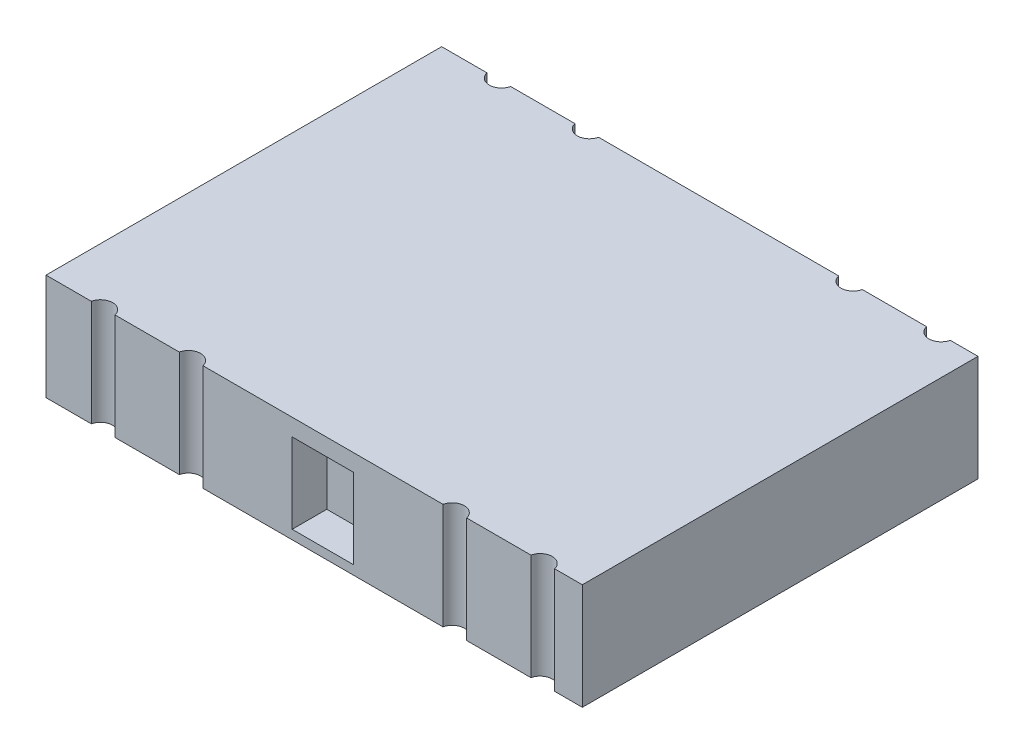
ISO-10303-21;
HEADER;
FILE_DESCRIPTION(('STEP AP214'),'2;1');
FILE_NAME('part.step','',(''),(''),'','','');
FILE_SCHEMA(('AUTOMOTIVE_DESIGN { 1 0 10303 214 1 1 1 1 }'));
ENDSEC;
DATA;
#1=APPLICATION_CONTEXT('core data for automotive mechanical design processes');
#2=APPLICATION_PROTOCOL_DEFINITION('international standard','automotive_design',2000,#1);
#3=PRODUCT_CONTEXT('',#1,'mechanical');
#4=PRODUCT('Part','Part','',(#3));
#5=PRODUCT_RELATED_PRODUCT_CATEGORY('part','',(#4));
#6=PRODUCT_DEFINITION_FORMATION('','',#4);
#7=PRODUCT_DEFINITION_CONTEXT('part definition',#1,'design');
#8=PRODUCT_DEFINITION('design','',#6,#7);
#9=PRODUCT_DEFINITION_SHAPE('','',#8);
#10=(LENGTH_UNIT() NAMED_UNIT(*) SI_UNIT(.MILLI.,.METRE.));
#11=(NAMED_UNIT(*) PLANE_ANGLE_UNIT() SI_UNIT($,.RADIAN.));
#12=(NAMED_UNIT(*) SI_UNIT($,.STERADIAN.) SOLID_ANGLE_UNIT());
#13=UNCERTAINTY_MEASURE_WITH_UNIT(LENGTH_MEASURE(1.E-05),#10,'distance_accuracy_value','');
#14=(GEOMETRIC_REPRESENTATION_CONTEXT(3) GLOBAL_UNCERTAINTY_ASSIGNED_CONTEXT((#13)) GLOBAL_UNIT_ASSIGNED_CONTEXT((#10,
#11,#12)) REPRESENTATION_CONTEXT('',''));
#15=CARTESIAN_POINT('',(0.,0.,0.));
#16=DIRECTION('',(0.,0.,1.));
#17=DIRECTION('',(1.,0.,0.));
#18=AXIS2_PLACEMENT_3D('',#15,#16,#17);
#19=CARTESIAN_POINT('',(1.143,17.1077301496695,5.715));
#20=DIRECTION('',(-1.,0.,0.));
#21=DIRECTION('',(0.,1.,0.));
#22=AXIS2_PLACEMENT_3D('',#19,#20,#21);
#23=PLANE('',#22);
#24=DIRECTION('',(0.,0.,-1.));
#25=VECTOR('',#24,1.);
#26=CARTESIAN_POINT('',(1.143,2.4384,5.715));
#27=LINE('',#26,#25);
#28=CARTESIAN_POINT('',(1.143,2.4384,5.715));
#29=VERTEX_POINT('',#28);
#30=CARTESIAN_POINT('',(1.143,2.4384,4.715));
#31=VERTEX_POINT('',#30);
#32=EDGE_CURVE('E11',#29,#31,#27,.T.);
#33=ORIENTED_EDGE('',*,*,#32,.T.);
#34=DIRECTION('',(0.,-1.,0.));
#35=VECTOR('',#34,1.);
#36=CARTESIAN_POINT('',(1.143,17.1077301496695,4.715));
#37=LINE('',#36,#35);
#38=CARTESIAN_POINT('',(1.143,0.127,4.715));
#39=VERTEX_POINT('',#38);
#40=EDGE_CURVE('E24',#31,#39,#37,.T.);
#41=ORIENTED_EDGE('',*,*,#40,.T.);
#42=DIRECTION('',(0.,0.,-1.));
#43=VECTOR('',#42,1.);
#44=CARTESIAN_POINT('',(1.143,0.127,5.715));
#45=LINE('',#44,#43);
#46=CARTESIAN_POINT('',(1.143,0.127,5.715));
#47=VERTEX_POINT('',#46);
#48=EDGE_CURVE('E418',#47,#39,#45,.T.);
#49=ORIENTED_EDGE('',*,*,#48,.F.);
#50=DIRECTION('',(0.,-1.,0.));
#51=VECTOR('',#50,1.);
#52=CARTESIAN_POINT('',(1.143,17.1077301496695,5.715));
#53=LINE('',#52,#51);
#54=EDGE_CURVE('E415',#29,#47,#53,.T.);
#55=ORIENTED_EDGE('',*,*,#54,.F.);
#56=EDGE_LOOP('',(#33,#41,#49,#55));
#57=FACE_BOUND('',#56,.T.);
#58=ADVANCED_FACE('F17',(#57),#23,.T.);
#59=CARTESIAN_POINT('',(-0.634999999999979,17.1077301496695,4.510628089302));
#60=DIRECTION('',(1.,0.,0.));
#61=DIRECTION('',(0.,-1.,0.));
#62=AXIS2_PLACEMENT_3D('',#59,#60,#61);
#63=PLANE('',#62);
#64=DIRECTION('',(0.,0.,1.));
#65=VECTOR('',#64,1.);
#66=CARTESIAN_POINT('',(-0.634999999999979,0.127,4.510628089302));
#67=LINE('',#66,#65);
#68=CARTESIAN_POINT('',(-0.634999999999979,0.127,4.715));
#69=VERTEX_POINT('',#68);
#70=CARTESIAN_POINT('',(-0.634999999999979,0.127,5.715));
#71=VERTEX_POINT('',#70);
#72=EDGE_CURVE('E413',#69,#71,#67,.T.);
#73=ORIENTED_EDGE('',*,*,#72,.F.);
#74=DIRECTION('',(0.,1.,0.));
#75=VECTOR('',#74,1.);
#76=CARTESIAN_POINT('',(-0.634999999999979,17.1077301496695,4.715));
#77=LINE('',#76,#75);
#78=CARTESIAN_POINT('',(-0.634999999999979,2.4384,4.715));
#79=VERTEX_POINT('',#78);
#80=EDGE_CURVE('E411',#69,#79,#77,.T.);
#81=ORIENTED_EDGE('',*,*,#80,.T.);
#82=DIRECTION('',(0.,0.,1.));
#83=VECTOR('',#82,1.);
#84=CARTESIAN_POINT('',(-0.634999999999979,2.4384,4.510628089302));
#85=LINE('',#84,#83);
#86=CARTESIAN_POINT('',(-0.634999999999979,2.4384,5.715));
#87=VERTEX_POINT('',#86);
#88=EDGE_CURVE('E409',#79,#87,#85,.T.);
#89=ORIENTED_EDGE('',*,*,#88,.T.);
#90=DIRECTION('',(0.,-1.,0.));
#91=VECTOR('',#90,1.);
#92=CARTESIAN_POINT('',(-0.634999999999979,17.1077301496695,5.715));
#93=LINE('',#92,#91);
#94=EDGE_CURVE('E406',#87,#71,#93,.T.);
#95=ORIENTED_EDGE('',*,*,#94,.T.);
#96=EDGE_LOOP('',(#73,#81,#89,#95));
#97=FACE_BOUND('',#96,.T.);
#98=ADVANCED_FACE('F429',(#97),#63,.T.);
#99=CARTESIAN_POINT('',(-0.634999999999979,17.1077301496695,-5.715));
#100=DIRECTION('',(1.,0.,0.));
#101=DIRECTION('',(0.,-1.,0.));
#102=AXIS2_PLACEMENT_3D('',#99,#100,#101);
#103=PLANE('',#102);
#104=DIRECTION('',(0.,0.,1.));
#105=VECTOR('',#104,1.);
#106=CARTESIAN_POINT('',(-0.634999999999979,2.4384,-5.715));
#107=LINE('',#106,#105);
#108=CARTESIAN_POINT('',(-0.634999999999979,2.4384,-5.7149999999999));
#109=VERTEX_POINT('',#108);
#110=CARTESIAN_POINT('',(-0.634999999999979,2.4384,-4.7149999999999));
#111=VERTEX_POINT('',#110);
#112=EDGE_CURVE('E404',#109,#111,#107,.T.);
#113=ORIENTED_EDGE('',*,*,#112,.T.);
#114=DIRECTION('',(0.,-1.,0.));
#115=VECTOR('',#114,1.);
#116=CARTESIAN_POINT('',(-0.634999999999979,17.1077301496695,-4.7149999999999));
#117=LINE('',#116,#115);
#118=CARTESIAN_POINT('',(-0.634999999999979,0.127,-4.7149999999999));
#119=VERTEX_POINT('',#118);
#120=EDGE_CURVE('E402',#111,#119,#117,.T.);
#121=ORIENTED_EDGE('',*,*,#120,.T.);
#122=DIRECTION('',(0.,0.,1.));
#123=VECTOR('',#122,1.);
#124=CARTESIAN_POINT('',(-0.634999999999979,0.127,-5.715));
#125=LINE('',#124,#123);
#126=CARTESIAN_POINT('',(-0.634999999999979,0.127,-5.715));
#127=VERTEX_POINT('',#126);
#128=EDGE_CURVE('E399',#127,#119,#125,.T.);
#129=ORIENTED_EDGE('',*,*,#128,.F.);
#130=DIRECTION('',(0.,-1.,0.));
#131=VECTOR('',#130,1.);
#132=CARTESIAN_POINT('',(-0.634999999999979,17.1077301496695,-5.715));
#133=LINE('',#132,#131);
#134=EDGE_CURVE('E396',#109,#127,#133,.T.);
#135=ORIENTED_EDGE('',*,*,#134,.F.);
#136=EDGE_LOOP('',(#113,#121,#129,#135));
#137=FACE_BOUND('',#136,.T.);
#138=ADVANCED_FACE('F453',(#137),#103,.T.);
#139=CARTESIAN_POINT('',(1.143,17.1077301496695,-4.510628089302));
#140=DIRECTION('',(-1.,0.,0.));
#141=DIRECTION('',(0.,1.,0.));
#142=AXIS2_PLACEMENT_3D('',#139,#140,#141);
#143=PLANE('',#142);
#144=DIRECTION('',(0.,0.,-1.));
#145=VECTOR('',#144,1.);
#146=CARTESIAN_POINT('',(1.143,0.127,-4.510628089302));
#147=LINE('',#146,#145);
#148=CARTESIAN_POINT('',(1.143,0.127,-4.7149999999999));
#149=VERTEX_POINT('',#148);
#150=CARTESIAN_POINT('',(1.143,0.127,-5.715));
#151=VERTEX_POINT('',#150);
#152=EDGE_CURVE('E394',#149,#151,#147,.T.);
#153=ORIENTED_EDGE('',*,*,#152,.F.);
#154=DIRECTION('',(0.,1.,0.));
#155=VECTOR('',#154,1.);
#156=CARTESIAN_POINT('',(1.143,17.1077301496695,-4.7149999999999));
#157=LINE('',#156,#155);
#158=CARTESIAN_POINT('',(1.143,2.4384,-4.7149999999999));
#159=VERTEX_POINT('',#158);
#160=EDGE_CURVE('E392',#149,#159,#157,.T.);
#161=ORIENTED_EDGE('',*,*,#160,.T.);
#162=DIRECTION('',(0.,0.,-1.));
#163=VECTOR('',#162,1.);
#164=CARTESIAN_POINT('',(1.143,2.4384,-4.510628089302));
#165=LINE('',#164,#163);
#166=CARTESIAN_POINT('',(1.143,2.4384,-5.715));
#167=VERTEX_POINT('',#166);
#168=EDGE_CURVE('E390',#159,#167,#165,.T.);
#169=ORIENTED_EDGE('',*,*,#168,.T.);
#170=DIRECTION('',(0.,-1.,0.));
#171=VECTOR('',#170,1.);
#172=CARTESIAN_POINT('',(1.143,17.1077301496695,-5.715));
#173=LINE('',#172,#171);
#174=EDGE_CURVE('E387',#167,#151,#173,.T.);
#175=ORIENTED_EDGE('',*,*,#174,.T.);
#176=EDGE_LOOP('',(#153,#161,#169,#175));
#177=FACE_BOUND('',#176,.T.);
#178=ADVANCED_FACE('F457',(#177),#143,.T.);
#179=CARTESIAN_POINT('',(0.254000000000129,0.127,0.));
#180=DIRECTION('',(0.,1.,0.));
#181=DIRECTION('',(1.,0.,0.));
#182=AXIS2_PLACEMENT_3D('',#179,#180,#181);
#183=PLANE('',#182);
#184=ORIENTED_EDGE('',*,*,#48,.T.);
#185=DIRECTION('',(1.,0.,0.));
#186=VECTOR('',#185,1.);
#187=CARTESIAN_POINT('',(-6.9400186103651,0.127,4.715));
#188=LINE('',#187,#186);
#189=EDGE_CURVE('E384',#69,#39,#188,.T.);
#190=ORIENTED_EDGE('',*,*,#189,.F.);
#191=ORIENTED_EDGE('',*,*,#72,.T.);
#192=DIRECTION('',(1.,0.,0.));
#193=VECTOR('',#192,1.);
#194=CARTESIAN_POINT('',(-0.634999999999979,0.127,5.715));
#195=LINE('',#194,#193);
#196=EDGE_CURVE('E381',#71,#47,#195,.T.);
#197=ORIENTED_EDGE('',*,*,#196,.T.);
#198=EDGE_LOOP('',(#184,#190,#191,#197));
#199=FACE_BOUND('',#198,.T.);
#200=ADVANCED_FACE('F423',(#199),#183,.T.);
#201=CARTESIAN_POINT('',(0.254000000000129,0.127,0.));
#202=DIRECTION('',(0.,1.,0.));
#203=DIRECTION('',(1.,0.,0.));
#204=AXIS2_PLACEMENT_3D('',#201,#202,#203);
#205=PLANE('',#204);
#206=ORIENTED_EDGE('',*,*,#128,.T.);
#207=DIRECTION('',(-1.,0.,0.));
#208=VECTOR('',#207,1.);
#209=CARTESIAN_POINT('',(-6.9400186103651,0.127,-4.7149999999999));
#210=LINE('',#209,#208);
#211=EDGE_CURVE('E378',#149,#119,#210,.T.);
#212=ORIENTED_EDGE('',*,*,#211,.F.);
#213=ORIENTED_EDGE('',*,*,#152,.T.);
#214=DIRECTION('',(-1.,0.,0.));
#215=VECTOR('',#214,1.);
#216=CARTESIAN_POINT('',(1.143,0.127,-5.715));
#217=LINE('',#216,#215);
#218=EDGE_CURVE('E375',#151,#127,#217,.T.);
#219=ORIENTED_EDGE('',*,*,#218,.T.);
#220=EDGE_LOOP('',(#206,#212,#213,#219));
#221=FACE_BOUND('',#220,.T.);
#222=ADVANCED_FACE('F466',(#221),#205,.T.);
#223=CARTESIAN_POINT('',(0.,2.4384,0.));
#224=DIRECTION('',(0.,1.,0.));
#225=DIRECTION('',(1.,0.,0.));
#226=AXIS2_PLACEMENT_3D('',#223,#224,#225);
#227=PLANE('',#226);
#228=DIRECTION('',(-1.,0.,0.));
#229=VECTOR('',#228,1.);
#230=CARTESIAN_POINT('',(0.,2.4384,4.715));
#231=LINE('',#230,#229);
#232=EDGE_CURVE('E372',#31,#79,#231,.T.);
#233=ORIENTED_EDGE('',*,*,#232,.F.);
#234=ORIENTED_EDGE('',*,*,#32,.F.);
#235=DIRECTION('',(1.,0.,0.));
#236=VECTOR('',#235,1.);
#237=CARTESIAN_POINT('',(-0.634999999999979,2.4384,5.715));
#238=LINE('',#237,#236);
#239=EDGE_CURVE('E369',#87,#29,#238,.T.);
#240=ORIENTED_EDGE('',*,*,#239,.F.);
#241=ORIENTED_EDGE('',*,*,#88,.F.);
#242=EDGE_LOOP('',(#233,#234,#240,#241));
#243=FACE_BOUND('',#242,.T.);
#244=ADVANCED_FACE('F431',(#243),#227,.F.);
#245=CARTESIAN_POINT('',(0.,2.4384,0.));
#246=DIRECTION('',(0.,1.,0.));
#247=DIRECTION('',(1.,0.,0.));
#248=AXIS2_PLACEMENT_3D('',#245,#246,#247);
#249=PLANE('',#248);
#250=DIRECTION('',(1.,0.,0.));
#251=VECTOR('',#250,1.);
#252=CARTESIAN_POINT('',(0.,2.4384,-4.7149999999999));
#253=LINE('',#252,#251);
#254=EDGE_CURVE('E366',#111,#159,#253,.T.);
#255=ORIENTED_EDGE('',*,*,#254,.F.);
#256=ORIENTED_EDGE('',*,*,#112,.F.);
#257=DIRECTION('',(-1.,0.,0.));
#258=VECTOR('',#257,1.);
#259=CARTESIAN_POINT('',(1.143,2.4384,-5.715));
#260=LINE('',#259,#258);
#261=EDGE_CURVE('E363',#167,#109,#260,.T.);
#262=ORIENTED_EDGE('',*,*,#261,.F.);
#263=ORIENTED_EDGE('',*,*,#168,.F.);
#264=EDGE_LOOP('',(#255,#256,#262,#263));
#265=FACE_BOUND('',#264,.T.);
#266=ADVANCED_FACE('F436',(#265),#249,.F.);
#267=CARTESIAN_POINT('',(3.7223956089275,2.794,5.715));
#268=DIRECTION('',(0.,0.,-1.));
#269=DIRECTION('',(0.,1.,0.));
#270=AXIS2_PLACEMENT_3D('',#267,#268,#269);
#271=PLANE('',#270);
#272=DIRECTION('',(0.,-1.,0.));
#273=VECTOR('',#272,1.);
#274=CARTESIAN_POINT('',(-3.2143956089275,2.794,5.715));
#275=LINE('',#274,#273);
#276=CARTESIAN_POINT('',(-3.2143956089275,2.9306,5.715));
#277=VERTEX_POINT('',#276);
#278=CARTESIAN_POINT('',(-3.2143956089275,-0.1366,5.715));
#279=VERTEX_POINT('',#278);
#280=EDGE_CURVE('E361',#277,#279,#275,.T.);
#281=ORIENTED_EDGE('',*,*,#280,.T.);
#282=DIRECTION('',(1.,0.,0.));
#283=VECTOR('',#282,1.);
#284=CARTESIAN_POINT('',(3.7223956089275,-0.1366,5.715));
#285=LINE('',#284,#283);
#286=CARTESIAN_POINT('',(3.7223956089275,-0.1366,5.715));
#287=VERTEX_POINT('',#286);
#288=EDGE_CURVE('E359',#279,#287,#285,.T.);
#289=ORIENTED_EDGE('',*,*,#288,.T.);
#290=DIRECTION('',(0.,-1.,0.));
#291=VECTOR('',#290,1.);
#292=CARTESIAN_POINT('',(3.7223956089275,2.794,5.715));
#293=LINE('',#292,#291);
#294=CARTESIAN_POINT('',(3.7223956089275,2.9306,5.715));
#295=VERTEX_POINT('',#294);
#296=EDGE_CURVE('E356',#295,#287,#293,.T.);
#297=ORIENTED_EDGE('',*,*,#296,.F.);
#298=DIRECTION('',(1.,0.,0.));
#299=VECTOR('',#298,1.);
#300=CARTESIAN_POINT('',(3.7223956089275,2.9306,5.715));
#301=LINE('',#300,#299);
#302=EDGE_CURVE('E353',#277,#295,#301,.T.);
#303=ORIENTED_EDGE('',*,*,#302,.F.);
#304=EDGE_LOOP('',(#281,#289,#297,#303));
#305=FACE_BOUND('',#304,.T.);
#306=ORIENTED_EDGE('',*,*,#196,.F.);
#307=ORIENTED_EDGE('',*,*,#94,.F.);
#308=ORIENTED_EDGE('',*,*,#239,.T.);
#309=ORIENTED_EDGE('',*,*,#54,.T.);
#310=EDGE_LOOP('',(#306,#307,#308,#309));
#311=FACE_BOUND('',#310,.T.);
#312=ADVANCED_FACE('F433',(#305,#311),#271,.F.);
#313=CARTESIAN_POINT('',(-3.2143956089275,2.794,-5.7149999999999));
#314=DIRECTION('',(0.,0.,1.));
#315=DIRECTION('',(0.,-1.,0.));
#316=AXIS2_PLACEMENT_3D('',#313,#314,#315);
#317=PLANE('',#316);
#318=DIRECTION('',(0.,-1.,0.));
#319=VECTOR('',#318,1.);
#320=CARTESIAN_POINT('',(3.7223956089275,2.794,-5.7149999999999));
#321=LINE('',#320,#319);
#322=CARTESIAN_POINT('',(3.7223956089275,2.9306,-5.7149999999999));
#323=VERTEX_POINT('',#322);
#324=CARTESIAN_POINT('',(3.7223956089275,-0.1366,-5.7149999999999));
#325=VERTEX_POINT('',#324);
#326=EDGE_CURVE('E351',#323,#325,#321,.T.);
#327=ORIENTED_EDGE('',*,*,#326,.T.);
#328=DIRECTION('',(-1.,0.,0.));
#329=VECTOR('',#328,1.);
#330=CARTESIAN_POINT('',(-3.2143956089275,-0.1366,-5.7149999999999));
#331=LINE('',#330,#329);
#332=CARTESIAN_POINT('',(-3.2143956089275,-0.1366,-5.7149999999999));
#333=VERTEX_POINT('',#332);
#334=EDGE_CURVE('E349',#325,#333,#331,.T.);
#335=ORIENTED_EDGE('',*,*,#334,.T.);
#336=DIRECTION('',(0.,-1.,0.));
#337=VECTOR('',#336,1.);
#338=CARTESIAN_POINT('',(-3.2143956089275,2.794,-5.7149999999999));
#339=LINE('',#338,#337);
#340=CARTESIAN_POINT('',(-3.2143956089275,2.9306,-5.7149999999999));
#341=VERTEX_POINT('',#340);
#342=EDGE_CURVE('E346',#341,#333,#339,.T.);
#343=ORIENTED_EDGE('',*,*,#342,.F.);
#344=DIRECTION('',(-1.,0.,0.));
#345=VECTOR('',#344,1.);
#346=CARTESIAN_POINT('',(-3.2143956089275,2.9306,-5.7149999999999));
#347=LINE('',#346,#345);
#348=EDGE_CURVE('E343',#323,#341,#347,.T.);
#349=ORIENTED_EDGE('',*,*,#348,.F.);
#350=EDGE_LOOP('',(#327,#335,#343,#349));
#351=FACE_BOUND('',#350,.T.);
#352=ORIENTED_EDGE('',*,*,#218,.F.);
#353=ORIENTED_EDGE('',*,*,#174,.F.);
#354=ORIENTED_EDGE('',*,*,#261,.T.);
#355=ORIENTED_EDGE('',*,*,#134,.T.);
#356=EDGE_LOOP('',(#352,#353,#354,#355));
#357=FACE_BOUND('',#356,.T.);
#358=ADVANCED_FACE('F435',(#351,#357),#317,.F.);
#359=CARTESIAN_POINT('',(-6.096,2.794,5.7912));
#360=DIRECTION('',(0.,-1.,0.));
#361=DIRECTION('',(-1.,0.,0.));
#362=AXIS2_PLACEMENT_3D('',#359,#360,#361);
#363=CYLINDRICAL_SURFACE('',#362,0.35);
#364=DIRECTION('',(0.,-1.,0.));
#365=VECTOR('',#364,1.);
#366=CARTESIAN_POINT('',(-6.4376043910725,2.794,5.715));
#367=LINE('',#366,#365);
#368=CARTESIAN_POINT('',(-6.4376043910725,2.9306,5.715));
#369=VERTEX_POINT('',#368);
#370=CARTESIAN_POINT('',(-6.4376043910725,-0.1366,5.715));
#371=VERTEX_POINT('',#370);
#372=EDGE_CURVE('E222',#369,#371,#367,.T.);
#373=ORIENTED_EDGE('',*,*,#372,.T.);
#374=CARTESIAN_POINT('',(-6.096,-0.1366,5.7912));
#375=DIRECTION('',(0.,-1.,0.));
#376=DIRECTION('',(1.,0.,0.));
#377=AXIS2_PLACEMENT_3D('',#374,#375,#376);
#378=CIRCLE('',#377,0.35);
#379=CARTESIAN_POINT('',(-5.7543956089275,-0.1366,5.715));
#380=VERTEX_POINT('',#379);
#381=EDGE_CURVE('E339',#371,#380,#378,.T.);
#382=ORIENTED_EDGE('',*,*,#381,.T.);
#383=DIRECTION('',(0.,-1.,0.));
#384=VECTOR('',#383,1.);
#385=CARTESIAN_POINT('',(-5.7543956089275,2.794,5.715));
#386=LINE('',#385,#384);
#387=CARTESIAN_POINT('',(-5.7543956089275,2.9306,5.715));
#388=VERTEX_POINT('',#387);
#389=EDGE_CURVE('E337',#388,#380,#386,.T.);
#390=ORIENTED_EDGE('',*,*,#389,.F.);
#391=CARTESIAN_POINT('',(-6.096,2.9306,5.7912));
#392=DIRECTION('',(0.,-1.,0.));
#393=DIRECTION('',(1.,0.,0.));
#394=AXIS2_PLACEMENT_3D('',#391,#392,#393);
#395=CIRCLE('',#394,0.35);
#396=EDGE_CURVE('E335',#369,#388,#395,.T.);
#397=ORIENTED_EDGE('',*,*,#396,.F.);
#398=EDGE_LOOP('',(#373,#382,#390,#397));
#399=FACE_BOUND('',#398,.T.);
#400=ADVANCED_FACE('F444',(#399),#363,.F.);
#401=CARTESIAN_POINT('',(-3.8976043910725,2.794,5.715));
#402=DIRECTION('',(0.,0.,-1.));
#403=DIRECTION('',(0.,1.,0.));
#404=AXIS2_PLACEMENT_3D('',#401,#402,#403);
#405=PLANE('',#404);
#406=ORIENTED_EDGE('',*,*,#389,.T.);
#407=DIRECTION('',(1.,0.,0.));
#408=VECTOR('',#407,1.);
#409=CARTESIAN_POINT('',(-3.8976043910725,-0.1366,5.715));
#410=LINE('',#409,#408);
#411=CARTESIAN_POINT('',(-3.8976043910725,-0.1366,5.715));
#412=VERTEX_POINT('',#411);
#413=EDGE_CURVE('E333',#380,#412,#410,.T.);
#414=ORIENTED_EDGE('',*,*,#413,.T.);
#415=DIRECTION('',(0.,-1.,0.));
#416=VECTOR('',#415,1.);
#417=CARTESIAN_POINT('',(-3.8976043910725,2.794,5.715));
#418=LINE('',#417,#416);
#419=CARTESIAN_POINT('',(-3.8976043910725,2.9306,5.715));
#420=VERTEX_POINT('',#419);
#421=EDGE_CURVE('E330',#420,#412,#418,.T.);
#422=ORIENTED_EDGE('',*,*,#421,.F.);
#423=DIRECTION('',(1.,0.,0.));
#424=VECTOR('',#423,1.);
#425=CARTESIAN_POINT('',(-3.8976043910725,2.9306,5.715));
#426=LINE('',#425,#424);
#427=EDGE_CURVE('E327',#388,#420,#426,.T.);
#428=ORIENTED_EDGE('',*,*,#427,.F.);
#429=EDGE_LOOP('',(#406,#414,#422,#428));
#430=FACE_BOUND('',#429,.T.);
#431=ADVANCED_FACE('F506',(#430),#405,.F.);
#432=CARTESIAN_POINT('',(-3.556,2.794,5.7912));
#433=DIRECTION('',(0.,-1.,0.));
#434=DIRECTION('',(-1.,0.,0.));
#435=AXIS2_PLACEMENT_3D('',#432,#433,#434);
#436=CYLINDRICAL_SURFACE('',#435,0.350000000000001);
#437=ORIENTED_EDGE('',*,*,#421,.T.);
#438=CARTESIAN_POINT('',(-3.556,-0.1366,5.7912));
#439=DIRECTION('',(0.,-1.,0.));
#440=DIRECTION('',(1.,0.,0.));
#441=AXIS2_PLACEMENT_3D('',#438,#439,#440);
#442=CIRCLE('',#441,0.350000000000001);
#443=EDGE_CURVE('E324',#412,#279,#442,.T.);
#444=ORIENTED_EDGE('',*,*,#443,.T.);
#445=ORIENTED_EDGE('',*,*,#280,.F.);
#446=CARTESIAN_POINT('',(-3.556,2.9306,5.7912));
#447=DIRECTION('',(0.,-1.,0.));
#448=DIRECTION('',(1.,0.,0.));
#449=AXIS2_PLACEMENT_3D('',#446,#447,#448);
#450=CIRCLE('',#449,0.350000000000001);
#451=EDGE_CURVE('E321',#420,#277,#450,.T.);
#452=ORIENTED_EDGE('',*,*,#451,.F.);
#453=EDGE_LOOP('',(#437,#444,#445,#452));
#454=FACE_BOUND('',#453,.T.);
#455=ADVANCED_FACE('F516',(#454),#436,.F.);
#456=CARTESIAN_POINT('',(4.064,2.794,5.7912));
#457=DIRECTION('',(0.,-1.,0.));
#458=DIRECTION('',(-1.,0.,0.));
#459=AXIS2_PLACEMENT_3D('',#456,#457,#458);
#460=CYLINDRICAL_SURFACE('',#459,0.350000000000001);
#461=ORIENTED_EDGE('',*,*,#296,.T.);
#462=CARTESIAN_POINT('',(4.064,-0.1366,5.7912));
#463=DIRECTION('',(0.,-1.,0.));
#464=DIRECTION('',(1.,0.,0.));
#465=AXIS2_PLACEMENT_3D('',#462,#463,#464);
#466=CIRCLE('',#465,0.350000000000001);
#467=CARTESIAN_POINT('',(4.4056043910725,-0.1366,5.715));
#468=VERTEX_POINT('',#467);
#469=EDGE_CURVE('E318',#287,#468,#466,.T.);
#470=ORIENTED_EDGE('',*,*,#469,.T.);
#471=DIRECTION('',(0.,-1.,0.));
#472=VECTOR('',#471,1.);
#473=CARTESIAN_POINT('',(4.4056043910725,2.794,5.715));
#474=LINE('',#473,#472);
#475=CARTESIAN_POINT('',(4.4056043910725,2.9306,5.715));
#476=VERTEX_POINT('',#475);
#477=EDGE_CURVE('E316',#476,#468,#474,.T.);
#478=ORIENTED_EDGE('',*,*,#477,.F.);
#479=CARTESIAN_POINT('',(4.064,2.9306,5.7912));
#480=DIRECTION('',(0.,-1.,0.));
#481=DIRECTION('',(1.,0.,0.));
#482=AXIS2_PLACEMENT_3D('',#479,#480,#481);
#483=CIRCLE('',#482,0.350000000000001);
#484=EDGE_CURVE('E314',#295,#476,#483,.T.);
#485=ORIENTED_EDGE('',*,*,#484,.F.);
#486=EDGE_LOOP('',(#461,#470,#478,#485));
#487=FACE_BOUND('',#486,.T.);
#488=ADVANCED_FACE('F526',(#487),#460,.F.);
#489=CARTESIAN_POINT('',(6.2623956089275,2.794,5.715));
#490=DIRECTION('',(0.,0.,-1.));
#491=DIRECTION('',(0.,1.,0.));
#492=AXIS2_PLACEMENT_3D('',#489,#490,#491);
#493=PLANE('',#492);
#494=ORIENTED_EDGE('',*,*,#477,.T.);
#495=DIRECTION('',(1.,0.,0.));
#496=VECTOR('',#495,1.);
#497=CARTESIAN_POINT('',(6.2623956089275,-0.1366,5.715));
#498=LINE('',#497,#496);
#499=CARTESIAN_POINT('',(6.2623956089275,-0.1366,5.715));
#500=VERTEX_POINT('',#499);
#501=EDGE_CURVE('E312',#468,#500,#498,.T.);
#502=ORIENTED_EDGE('',*,*,#501,.T.);
#503=DIRECTION('',(0.,-1.,0.));
#504=VECTOR('',#503,1.);
#505=CARTESIAN_POINT('',(6.2623956089275,2.794,5.715));
#506=LINE('',#505,#504);
#507=CARTESIAN_POINT('',(6.2623956089275,2.9306,5.715));
#508=VERTEX_POINT('',#507);
#509=EDGE_CURVE('E309',#508,#500,#506,.T.);
#510=ORIENTED_EDGE('',*,*,#509,.F.);
#511=DIRECTION('',(1.,0.,0.));
#512=VECTOR('',#511,1.);
#513=CARTESIAN_POINT('',(6.2623956089275,2.9306,5.715));
#514=LINE('',#513,#512);
#515=EDGE_CURVE('E306',#476,#508,#514,.T.);
#516=ORIENTED_EDGE('',*,*,#515,.F.);
#517=EDGE_LOOP('',(#494,#502,#510,#516));
#518=FACE_BOUND('',#517,.T.);
#519=ADVANCED_FACE('F536',(#518),#493,.F.);
#520=CARTESIAN_POINT('',(6.604,2.794,5.7912));
#521=DIRECTION('',(0.,-1.,0.));
#522=DIRECTION('',(-1.,0.,0.));
#523=AXIS2_PLACEMENT_3D('',#520,#521,#522);
#524=CYLINDRICAL_SURFACE('',#523,0.350000000000001);
#525=ORIENTED_EDGE('',*,*,#509,.T.);
#526=CARTESIAN_POINT('',(6.604,-0.1366,5.7912));
#527=DIRECTION('',(0.,-1.,0.));
#528=DIRECTION('',(1.,0.,0.));
#529=AXIS2_PLACEMENT_3D('',#526,#527,#528);
#530=CIRCLE('',#529,0.350000000000001);
#531=CARTESIAN_POINT('',(6.9456043910725,-0.1366,5.715));
#532=VERTEX_POINT('',#531);
#533=EDGE_CURVE('E303',#500,#532,#530,.T.);
#534=ORIENTED_EDGE('',*,*,#533,.T.);
#535=DIRECTION('',(0.,-1.,0.));
#536=VECTOR('',#535,1.);
#537=CARTESIAN_POINT('',(6.9456043910725,2.794,5.715));
#538=LINE('',#537,#536);
#539=CARTESIAN_POINT('',(6.9456043910725,2.9306,5.715));
#540=VERTEX_POINT('',#539);
#541=EDGE_CURVE('E301',#540,#532,#538,.T.);
#542=ORIENTED_EDGE('',*,*,#541,.F.);
#543=CARTESIAN_POINT('',(6.604,2.9306,5.7912));
#544=DIRECTION('',(0.,-1.,0.));
#545=DIRECTION('',(1.,0.,0.));
#546=AXIS2_PLACEMENT_3D('',#543,#544,#545);
#547=CIRCLE('',#546,0.350000000000001);
#548=EDGE_CURVE('E299',#508,#540,#547,.T.);
#549=ORIENTED_EDGE('',*,*,#548,.F.);
#550=EDGE_LOOP('',(#525,#534,#542,#549));
#551=FACE_BOUND('',#550,.T.);
#552=ADVANCED_FACE('F546',(#551),#524,.F.);
#553=CARTESIAN_POINT('',(7.747,2.794,5.715));
#554=DIRECTION('',(0.,0.,-1.));
#555=DIRECTION('',(0.,1.,0.));
#556=AXIS2_PLACEMENT_3D('',#553,#554,#555);
#557=PLANE('',#556);
#558=ORIENTED_EDGE('',*,*,#541,.T.);
#559=DIRECTION('',(1.,0.,0.));
#560=VECTOR('',#559,1.);
#561=CARTESIAN_POINT('',(7.747,-0.1366,5.715));
#562=LINE('',#561,#560);
#563=CARTESIAN_POINT('',(7.747,-0.1366,5.715));
#564=VERTEX_POINT('',#563);
#565=EDGE_CURVE('E297',#532,#564,#562,.T.);
#566=ORIENTED_EDGE('',*,*,#565,.T.);
#567=DIRECTION('',(0.,-1.,0.));
#568=VECTOR('',#567,1.);
#569=CARTESIAN_POINT('',(7.747,2.794,5.715));
#570=LINE('',#569,#568);
#571=CARTESIAN_POINT('',(7.747,2.9306,5.715));
#572=VERTEX_POINT('',#571);
#573=EDGE_CURVE('E294',#572,#564,#570,.T.);
#574=ORIENTED_EDGE('',*,*,#573,.F.);
#575=DIRECTION('',(1.,0.,0.));
#576=VECTOR('',#575,1.);
#577=CARTESIAN_POINT('',(7.747,2.9306,5.715));
#578=LINE('',#577,#576);
#579=EDGE_CURVE('E291',#540,#572,#578,.T.);
#580=ORIENTED_EDGE('',*,*,#579,.F.);
#581=EDGE_LOOP('',(#558,#566,#574,#580));
#582=FACE_BOUND('',#581,.T.);
#583=ADVANCED_FACE('F556',(#582),#557,.F.);
#584=CARTESIAN_POINT('',(7.747,2.794,-5.715));
#585=DIRECTION('',(-1.,0.,0.));
#586=DIRECTION('',(0.,1.,0.));
#587=AXIS2_PLACEMENT_3D('',#584,#585,#586);
#588=PLANE('',#587);
#589=ORIENTED_EDGE('',*,*,#573,.T.);
#590=DIRECTION('',(0.,0.,-1.));
#591=VECTOR('',#590,1.);
#592=CARTESIAN_POINT('',(7.747,-0.1366,-5.715));
#593=LINE('',#592,#591);
#594=CARTESIAN_POINT('',(7.747,-0.1366,-5.715));
#595=VERTEX_POINT('',#594);
#596=EDGE_CURVE('E289',#564,#595,#593,.T.);
#597=ORIENTED_EDGE('',*,*,#596,.T.);
#598=DIRECTION('',(0.,-1.,0.));
#599=VECTOR('',#598,1.);
#600=CARTESIAN_POINT('',(7.747,2.794,-5.715));
#601=LINE('',#600,#599);
#602=CARTESIAN_POINT('',(7.747,2.9306,-5.715));
#603=VERTEX_POINT('',#602);
#604=EDGE_CURVE('E286',#603,#595,#601,.T.);
#605=ORIENTED_EDGE('',*,*,#604,.F.);
#606=DIRECTION('',(0.,0.,-1.));
#607=VECTOR('',#606,1.);
#608=CARTESIAN_POINT('',(7.747,2.9306,-5.715));
#609=LINE('',#608,#607);
#610=EDGE_CURVE('E283',#572,#603,#609,.T.);
#611=ORIENTED_EDGE('',*,*,#610,.F.);
#612=EDGE_LOOP('',(#589,#597,#605,#611));
#613=FACE_BOUND('',#612,.T.);
#614=ADVANCED_FACE('F566',(#613),#588,.F.);
#615=CARTESIAN_POINT('',(6.9456043910725,2.794,-5.7149999999999));
#616=DIRECTION('',(0.,0.,1.));
#617=DIRECTION('',(1.,0.,0.));
#618=AXIS2_PLACEMENT_3D('',#615,#616,#617);
#619=PLANE('',#618);
#620=ORIENTED_EDGE('',*,*,#604,.T.);
#621=DIRECTION('',(-1.,0.,0.));
#622=VECTOR('',#621,1.);
#623=CARTESIAN_POINT('',(6.9456043910725,-0.1366,-5.7149999999999));
#624=LINE('',#623,#622);
#625=CARTESIAN_POINT('',(6.9456043910725,-0.1366,-5.7149999999999));
#626=VERTEX_POINT('',#625);
#627=EDGE_CURVE('E281',#595,#626,#624,.T.);
#628=ORIENTED_EDGE('',*,*,#627,.T.);
#629=DIRECTION('',(0.,-1.,0.));
#630=VECTOR('',#629,1.);
#631=CARTESIAN_POINT('',(6.9456043910725,2.794,-5.7149999999999));
#632=LINE('',#631,#630);
#633=CARTESIAN_POINT('',(6.9456043910725,2.9306,-5.7149999999999));
#634=VERTEX_POINT('',#633);
#635=EDGE_CURVE('E278',#634,#626,#632,.T.);
#636=ORIENTED_EDGE('',*,*,#635,.F.);
#637=DIRECTION('',(-1.,0.,0.));
#638=VECTOR('',#637,1.);
#639=CARTESIAN_POINT('',(6.9456043910725,2.9306,-5.7149999999999));
#640=LINE('',#639,#638);
#641=EDGE_CURVE('E275',#603,#634,#640,.T.);
#642=ORIENTED_EDGE('',*,*,#641,.F.);
#643=EDGE_LOOP('',(#620,#628,#636,#642));
#644=FACE_BOUND('',#643,.T.);
#645=ADVANCED_FACE('F576',(#644),#619,.F.);
#646=CARTESIAN_POINT('',(6.604,2.794,-5.7911999999999));
#647=DIRECTION('',(0.,-1.,0.));
#648=DIRECTION('',(-1.,0.,0.));
#649=AXIS2_PLACEMENT_3D('',#646,#647,#648);
#650=CYLINDRICAL_SURFACE('',#649,0.35);
#651=ORIENTED_EDGE('',*,*,#635,.T.);
#652=CARTESIAN_POINT('',(6.604,-0.1366,-5.7911999999999));
#653=DIRECTION('',(0.,-1.,0.));
#654=DIRECTION('',(1.,0.,0.));
#655=AXIS2_PLACEMENT_3D('',#652,#653,#654);
#656=CIRCLE('',#655,0.35);
#657=CARTESIAN_POINT('',(6.2623956089275,-0.1366,-5.7149999999999));
#658=VERTEX_POINT('',#657);
#659=EDGE_CURVE('E272',#626,#658,#656,.T.);
#660=ORIENTED_EDGE('',*,*,#659,.T.);
#661=DIRECTION('',(0.,-1.,0.));
#662=VECTOR('',#661,1.);
#663=CARTESIAN_POINT('',(6.2623956089275,2.794,-5.7149999999999));
#664=LINE('',#663,#662);
#665=CARTESIAN_POINT('',(6.2623956089275,2.9306,-5.7149999999999));
#666=VERTEX_POINT('',#665);
#667=EDGE_CURVE('E270',#666,#658,#664,.T.);
#668=ORIENTED_EDGE('',*,*,#667,.F.);
#669=CARTESIAN_POINT('',(6.604,2.9306,-5.7911999999999));
#670=DIRECTION('',(0.,-1.,0.));
#671=DIRECTION('',(1.,0.,0.));
#672=AXIS2_PLACEMENT_3D('',#669,#670,#671);
#673=CIRCLE('',#672,0.35);
#674=EDGE_CURVE('E268',#634,#666,#673,.T.);
#675=ORIENTED_EDGE('',*,*,#674,.F.);
#676=EDGE_LOOP('',(#651,#660,#668,#675));
#677=FACE_BOUND('',#676,.T.);
#678=ADVANCED_FACE('F586',(#677),#650,.F.);
#679=CARTESIAN_POINT('',(4.4056043910725,2.794,-5.7149999999999));
#680=DIRECTION('',(0.,0.,1.));
#681=DIRECTION('',(0.,-1.,0.));
#682=AXIS2_PLACEMENT_3D('',#679,#680,#681);
#683=PLANE('',#682);
#684=ORIENTED_EDGE('',*,*,#667,.T.);
#685=DIRECTION('',(-1.,0.,0.));
#686=VECTOR('',#685,1.);
#687=CARTESIAN_POINT('',(4.4056043910725,-0.1366,-5.7149999999999));
#688=LINE('',#687,#686);
#689=CARTESIAN_POINT('',(4.4056043910725,-0.1366,-5.7149999999999));
#690=VERTEX_POINT('',#689);
#691=EDGE_CURVE('E266',#658,#690,#688,.T.);
#692=ORIENTED_EDGE('',*,*,#691,.T.);
#693=DIRECTION('',(0.,-1.,0.));
#694=VECTOR('',#693,1.);
#695=CARTESIAN_POINT('',(4.4056043910725,2.794,-5.7149999999999));
#696=LINE('',#695,#694);
#697=CARTESIAN_POINT('',(4.4056043910725,2.9306,-5.7149999999999));
#698=VERTEX_POINT('',#697);
#699=EDGE_CURVE('E263',#698,#690,#696,.T.);
#700=ORIENTED_EDGE('',*,*,#699,.F.);
#701=DIRECTION('',(-1.,0.,0.));
#702=VECTOR('',#701,1.);
#703=CARTESIAN_POINT('',(4.4056043910725,2.9306,-5.7149999999999));
#704=LINE('',#703,#702);
#705=EDGE_CURVE('E260',#666,#698,#704,.T.);
#706=ORIENTED_EDGE('',*,*,#705,.F.);
#707=EDGE_LOOP('',(#684,#692,#700,#706));
#708=FACE_BOUND('',#707,.T.);
#709=ADVANCED_FACE('F596',(#708),#683,.F.);
#710=CARTESIAN_POINT('',(4.064,2.794,-5.7911999999999));
#711=DIRECTION('',(0.,-1.,0.));
#712=DIRECTION('',(-1.,0.,0.));
#713=AXIS2_PLACEMENT_3D('',#710,#711,#712);
#714=CYLINDRICAL_SURFACE('',#713,0.350000000000001);
#715=ORIENTED_EDGE('',*,*,#699,.T.);
#716=CARTESIAN_POINT('',(4.064,-0.1366,-5.7911999999999));
#717=DIRECTION('',(0.,-1.,0.));
#718=DIRECTION('',(1.,0.,0.));
#719=AXIS2_PLACEMENT_3D('',#716,#717,#718);
#720=CIRCLE('',#719,0.35);
#721=EDGE_CURVE('E257',#690,#325,#720,.T.);
#722=ORIENTED_EDGE('',*,*,#721,.T.);
#723=ORIENTED_EDGE('',*,*,#326,.F.);
#724=CARTESIAN_POINT('',(4.064,2.9306,-5.7911999999999));
#725=DIRECTION('',(0.,-1.,0.));
#726=DIRECTION('',(1.,0.,0.));
#727=AXIS2_PLACEMENT_3D('',#724,#725,#726);
#728=CIRCLE('',#727,0.35);
#729=EDGE_CURVE('E254',#698,#323,#728,.T.);
#730=ORIENTED_EDGE('',*,*,#729,.F.);
#731=EDGE_LOOP('',(#715,#722,#723,#730));
#732=FACE_BOUND('',#731,.T.);
#733=ADVANCED_FACE('F606',(#732),#714,.F.);
#734=CARTESIAN_POINT('',(-3.556,2.794,-5.7911999999999));
#735=DIRECTION('',(0.,-1.,0.));
#736=DIRECTION('',(-1.,0.,0.));
#737=AXIS2_PLACEMENT_3D('',#734,#735,#736);
#738=CYLINDRICAL_SURFACE('',#737,0.350000000000001);
#739=ORIENTED_EDGE('',*,*,#342,.T.);
#740=CARTESIAN_POINT('',(-3.556,-0.1366,-5.7911999999999));
#741=DIRECTION('',(0.,-1.,0.));
#742=DIRECTION('',(1.,0.,0.));
#743=AXIS2_PLACEMENT_3D('',#740,#741,#742);
#744=CIRCLE('',#743,0.350000000000001);
#745=CARTESIAN_POINT('',(-3.8976043910725,-0.1366,-5.7149999999999));
#746=VERTEX_POINT('',#745);
#747=EDGE_CURVE('E251',#333,#746,#744,.T.);
#748=ORIENTED_EDGE('',*,*,#747,.T.);
#749=DIRECTION('',(0.,-1.,0.));
#750=VECTOR('',#749,1.);
#751=CARTESIAN_POINT('',(-3.8976043910725,2.794,-5.7149999999999));
#752=LINE('',#751,#750);
#753=CARTESIAN_POINT('',(-3.8976043910725,2.9306,-5.7149999999999));
#754=VERTEX_POINT('',#753);
#755=EDGE_CURVE('E249',#754,#746,#752,.T.);
#756=ORIENTED_EDGE('',*,*,#755,.F.);
#757=CARTESIAN_POINT('',(-3.556,2.9306,-5.7911999999999));
#758=DIRECTION('',(0.,-1.,0.));
#759=DIRECTION('',(1.,0.,0.));
#760=AXIS2_PLACEMENT_3D('',#757,#758,#759);
#761=CIRCLE('',#760,0.350000000000001);
#762=EDGE_CURVE('E247',#341,#754,#761,.T.);
#763=ORIENTED_EDGE('',*,*,#762,.F.);
#764=EDGE_LOOP('',(#739,#748,#756,#763));
#765=FACE_BOUND('',#764,.T.);
#766=ADVANCED_FACE('F616',(#765),#738,.F.);
#767=CARTESIAN_POINT('',(-5.7543956089275,2.794,-5.7149999999999));
#768=DIRECTION('',(0.,0.,1.));
#769=DIRECTION('',(0.,-1.,0.));
#770=AXIS2_PLACEMENT_3D('',#767,#768,#769);
#771=PLANE('',#770);
#772=ORIENTED_EDGE('',*,*,#755,.T.);
#773=DIRECTION('',(-1.,0.,0.));
#774=VECTOR('',#773,1.);
#775=CARTESIAN_POINT('',(-5.7543956089275,-0.1366,-5.7149999999999));
#776=LINE('',#775,#774);
#777=CARTESIAN_POINT('',(-5.7543956089275,-0.1366,-5.7149999999999));
#778=VERTEX_POINT('',#777);
#779=EDGE_CURVE('E245',#746,#778,#776,.T.);
#780=ORIENTED_EDGE('',*,*,#779,.T.);
#781=DIRECTION('',(0.,-1.,0.));
#782=VECTOR('',#781,1.);
#783=CARTESIAN_POINT('',(-5.7543956089275,2.794,-5.7149999999999));
#784=LINE('',#783,#782);
#785=CARTESIAN_POINT('',(-5.7543956089275,2.9306,-5.7149999999999));
#786=VERTEX_POINT('',#785);
#787=EDGE_CURVE('E242',#786,#778,#784,.T.);
#788=ORIENTED_EDGE('',*,*,#787,.F.);
#789=DIRECTION('',(-1.,0.,0.));
#790=VECTOR('',#789,1.);
#791=CARTESIAN_POINT('',(-5.7543956089275,2.9306,-5.7149999999999));
#792=LINE('',#791,#790);
#793=EDGE_CURVE('E239',#754,#786,#792,.T.);
#794=ORIENTED_EDGE('',*,*,#793,.F.);
#795=EDGE_LOOP('',(#772,#780,#788,#794));
#796=FACE_BOUND('',#795,.T.);
#797=ADVANCED_FACE('F626',(#796),#771,.F.);
#798=CARTESIAN_POINT('',(-6.096,2.794,-5.7911999999999));
#799=DIRECTION('',(0.,-1.,0.));
#800=DIRECTION('',(-1.,0.,0.));
#801=AXIS2_PLACEMENT_3D('',#798,#799,#800);
#802=CYLINDRICAL_SURFACE('',#801,0.35);
#803=ORIENTED_EDGE('',*,*,#787,.T.);
#804=CARTESIAN_POINT('',(-6.096,-0.1366,-5.7911999999999));
#805=DIRECTION('',(0.,-1.,0.));
#806=DIRECTION('',(1.,0.,0.));
#807=AXIS2_PLACEMENT_3D('',#804,#805,#806);
#808=CIRCLE('',#807,0.35);
#809=CARTESIAN_POINT('',(-6.4376043910725,-0.1366,-5.7149999999999));
#810=VERTEX_POINT('',#809);
#811=EDGE_CURVE('E236',#778,#810,#808,.T.);
#812=ORIENTED_EDGE('',*,*,#811,.T.);
#813=DIRECTION('',(0.,-1.,0.));
#814=VECTOR('',#813,1.);
#815=CARTESIAN_POINT('',(-6.4376043910725,2.794,-5.7149999999999));
#816=LINE('',#815,#814);
#817=CARTESIAN_POINT('',(-6.4376043910725,2.9306,-5.7149999999999));
#818=VERTEX_POINT('',#817);
#819=EDGE_CURVE('E234',#818,#810,#816,.T.);
#820=ORIENTED_EDGE('',*,*,#819,.F.);
#821=CARTESIAN_POINT('',(-6.096,2.9306,-5.7911999999999));
#822=DIRECTION('',(0.,-1.,0.));
#823=DIRECTION('',(1.,0.,0.));
#824=AXIS2_PLACEMENT_3D('',#821,#822,#823);
#825=CIRCLE('',#824,0.35);
#826=EDGE_CURVE('E232',#786,#818,#825,.T.);
#827=ORIENTED_EDGE('',*,*,#826,.F.);
#828=EDGE_LOOP('',(#803,#812,#820,#827));
#829=FACE_BOUND('',#828,.T.);
#830=ADVANCED_FACE('F636',(#829),#802,.F.);
#831=CARTESIAN_POINT('',(-7.747,2.794,-5.715));
#832=DIRECTION('',(0.,0.,1.));
#833=DIRECTION('',(1.,0.,0.));
#834=AXIS2_PLACEMENT_3D('',#831,#832,#833);
#835=PLANE('',#834);
#836=ORIENTED_EDGE('',*,*,#819,.T.);
#837=DIRECTION('',(-1.,0.,0.));
#838=VECTOR('',#837,1.);
#839=CARTESIAN_POINT('',(-7.747,-0.1366,-5.715));
#840=LINE('',#839,#838);
#841=CARTESIAN_POINT('',(-7.747,-0.1366,-5.715));
#842=VERTEX_POINT('',#841);
#843=EDGE_CURVE('E230',#810,#842,#840,.T.);
#844=ORIENTED_EDGE('',*,*,#843,.T.);
#845=DIRECTION('',(0.,-1.,0.));
#846=VECTOR('',#845,1.);
#847=CARTESIAN_POINT('',(-7.747,2.794,-5.715));
#848=LINE('',#847,#846);
#849=CARTESIAN_POINT('',(-7.747,2.9306,-5.715));
#850=VERTEX_POINT('',#849);
#851=EDGE_CURVE('E228',#850,#842,#848,.T.);
#852=ORIENTED_EDGE('',*,*,#851,.F.);
#853=DIRECTION('',(-1.,0.,0.));
#854=VECTOR('',#853,1.);
#855=CARTESIAN_POINT('',(-7.747,2.9306,-5.715));
#856=LINE('',#855,#854);
#857=EDGE_CURVE('E216',#818,#850,#856,.T.);
#858=ORIENTED_EDGE('',*,*,#857,.F.);
#859=EDGE_LOOP('',(#836,#844,#852,#858));
#860=FACE_BOUND('',#859,.T.);
#861=ADVANCED_FACE('F646',(#860),#835,.F.);
#862=CARTESIAN_POINT('',(-7.747,2.794,5.715));
#863=DIRECTION('',(1.,0.,0.));
#864=DIRECTION('',(0.,-1.,0.));
#865=AXIS2_PLACEMENT_3D('',#862,#863,#864);
#866=PLANE('',#865);
#867=ORIENTED_EDGE('',*,*,#851,.T.);
#868=DIRECTION('',(0.,0.,1.));
#869=VECTOR('',#868,1.);
#870=CARTESIAN_POINT('',(-7.747,-0.1366,5.715));
#871=LINE('',#870,#869);
#872=CARTESIAN_POINT('',(-7.747,-0.1366,5.715));
#873=VERTEX_POINT('',#872);
#874=EDGE_CURVE('E204',#842,#873,#871,.T.);
#875=ORIENTED_EDGE('',*,*,#874,.T.);
#876=DIRECTION('',(0.,-1.,0.));
#877=VECTOR('',#876,1.);
#878=CARTESIAN_POINT('',(-7.747,2.794,5.715));
#879=LINE('',#878,#877);
#880=CARTESIAN_POINT('',(-7.747,2.9306,5.715));
#881=VERTEX_POINT('',#880);
#882=EDGE_CURVE('E198',#881,#873,#879,.T.);
#883=ORIENTED_EDGE('',*,*,#882,.F.);
#884=DIRECTION('',(0.,0.,1.));
#885=VECTOR('',#884,1.);
#886=CARTESIAN_POINT('',(-7.747,2.9306,5.715));
#887=LINE('',#886,#885);
#888=EDGE_CURVE('E202',#850,#881,#887,.T.);
#889=ORIENTED_EDGE('',*,*,#888,.F.);
#890=EDGE_LOOP('',(#867,#875,#883,#889));
#891=FACE_BOUND('',#890,.T.);
#892=ADVANCED_FACE('F201',(#891),#866,.F.);
#893=CARTESIAN_POINT('',(-6.4376043910725,2.794,5.715));
#894=DIRECTION('',(0.,0.,-1.));
#895=DIRECTION('',(0.,1.,0.));
#896=AXIS2_PLACEMENT_3D('',#893,#894,#895);
#897=PLANE('',#896);
#898=ORIENTED_EDGE('',*,*,#882,.T.);
#899=DIRECTION('',(1.,0.,0.));
#900=VECTOR('',#899,1.);
#901=CARTESIAN_POINT('',(-6.4376043910725,-0.1366,5.715));
#902=LINE('',#901,#900);
#903=EDGE_CURVE('E217',#873,#371,#902,.T.);
#904=ORIENTED_EDGE('',*,*,#903,.T.);
#905=ORIENTED_EDGE('',*,*,#372,.F.);
#906=DIRECTION('',(1.,0.,0.));
#907=VECTOR('',#906,1.);
#908=CARTESIAN_POINT('',(-6.4376043910725,2.9306,5.715));
#909=LINE('',#908,#907);
#910=EDGE_CURVE('E214',#881,#369,#909,.T.);
#911=ORIENTED_EDGE('',*,*,#910,.F.);
#912=EDGE_LOOP('',(#898,#904,#905,#911));
#913=FACE_BOUND('',#912,.T.);
#914=ADVANCED_FACE('F220',(#913),#897,.F.);
#915=CARTESIAN_POINT('',(-6.9400186103651,19.2822773874933,-4.7149999999999));
#916=DIRECTION('',(0.,0.,1.));
#917=DIRECTION('',(0.,-1.,0.));
#918=AXIS2_PLACEMENT_3D('',#915,#916,#917);
#919=PLANE('',#918);
#920=ORIENTED_EDGE('',*,*,#120,.F.);
#921=ORIENTED_EDGE('',*,*,#254,.T.);
#922=ORIENTED_EDGE('',*,*,#160,.F.);
#923=ORIENTED_EDGE('',*,*,#211,.T.);
#924=EDGE_LOOP('',(#920,#921,#922,#923));
#925=FACE_BOUND('',#924,.T.);
#926=ADVANCED_FACE('F673',(#925),#919,.F.);
#927=CARTESIAN_POINT('',(-6.9400186103651,19.2822773874933,4.715));
#928=DIRECTION('',(0.,0.,-1.));
#929=DIRECTION('',(-1.,0.,0.));
#930=AXIS2_PLACEMENT_3D('',#927,#928,#929);
#931=PLANE('',#930);
#932=ORIENTED_EDGE('',*,*,#40,.F.);
#933=ORIENTED_EDGE('',*,*,#232,.T.);
#934=ORIENTED_EDGE('',*,*,#80,.F.);
#935=ORIENTED_EDGE('',*,*,#189,.T.);
#936=EDGE_LOOP('',(#932,#933,#934,#935));
#937=FACE_BOUND('',#936,.T.);
#938=ADVANCED_FACE('F426',(#937),#931,.F.);
#939=CARTESIAN_POINT('',(-6.096,-0.1366,5.7912));
#940=DIRECTION('',(0.,1.,0.));
#941=DIRECTION('',(1.,0.,0.));
#942=AXIS2_PLACEMENT_3D('',#939,#940,#941);
#943=PLANE('',#942);
#944=ORIENTED_EDGE('',*,*,#381,.F.);
#945=ORIENTED_EDGE('',*,*,#903,.F.);
#946=ORIENTED_EDGE('',*,*,#874,.F.);
#947=ORIENTED_EDGE('',*,*,#843,.F.);
#948=ORIENTED_EDGE('',*,*,#811,.F.);
#949=ORIENTED_EDGE('',*,*,#779,.F.);
#950=ORIENTED_EDGE('',*,*,#747,.F.);
#951=ORIENTED_EDGE('',*,*,#334,.F.);
#952=ORIENTED_EDGE('',*,*,#721,.F.);
#953=ORIENTED_EDGE('',*,*,#691,.F.);
#954=ORIENTED_EDGE('',*,*,#659,.F.);
#955=ORIENTED_EDGE('',*,*,#627,.F.);
#956=ORIENTED_EDGE('',*,*,#596,.F.);
#957=ORIENTED_EDGE('',*,*,#565,.F.);
#958=ORIENTED_EDGE('',*,*,#533,.F.);
#959=ORIENTED_EDGE('',*,*,#501,.F.);
#960=ORIENTED_EDGE('',*,*,#469,.F.);
#961=ORIENTED_EDGE('',*,*,#288,.F.);
#962=ORIENTED_EDGE('',*,*,#443,.F.);
#963=ORIENTED_EDGE('',*,*,#413,.F.);
#964=EDGE_LOOP('',(#944,#945,#946,#947,#948,#949,#950,#951,#952,#953,#954,#955,#956,#957,#958,
#959,#960,#961,#962,#963));
#965=FACE_BOUND('',#964,.T.);
#966=ADVANCED_FACE('F691',(#965),#943,.F.);
#967=CARTESIAN_POINT('',(-6.096,2.9306,5.7912));
#968=DIRECTION('',(0.,1.,0.));
#969=DIRECTION('',(1.,0.,0.));
#970=AXIS2_PLACEMENT_3D('',#967,#968,#969);
#971=PLANE('',#970);
#972=ORIENTED_EDGE('',*,*,#396,.T.);
#973=ORIENTED_EDGE('',*,*,#427,.T.);
#974=ORIENTED_EDGE('',*,*,#451,.T.);
#975=ORIENTED_EDGE('',*,*,#302,.T.);
#976=ORIENTED_EDGE('',*,*,#484,.T.);
#977=ORIENTED_EDGE('',*,*,#515,.T.);
#978=ORIENTED_EDGE('',*,*,#548,.T.);
#979=ORIENTED_EDGE('',*,*,#579,.T.);
#980=ORIENTED_EDGE('',*,*,#610,.T.);
#981=ORIENTED_EDGE('',*,*,#641,.T.);
#982=ORIENTED_EDGE('',*,*,#674,.T.);
#983=ORIENTED_EDGE('',*,*,#705,.T.);
#984=ORIENTED_EDGE('',*,*,#729,.T.);
#985=ORIENTED_EDGE('',*,*,#348,.T.);
#986=ORIENTED_EDGE('',*,*,#762,.T.);
#987=ORIENTED_EDGE('',*,*,#793,.T.);
#988=ORIENTED_EDGE('',*,*,#826,.T.);
#989=ORIENTED_EDGE('',*,*,#857,.T.);
#990=ORIENTED_EDGE('',*,*,#888,.T.);
#991=ORIENTED_EDGE('',*,*,#910,.T.);
#992=EDGE_LOOP('',(#972,#973,#974,#975,#976,#977,#978,#979,#980,#981,#982,#983,#984,#985,#986,
#987,#988,#989,#990,#991));
#993=FACE_BOUND('',#992,.T.);
#994=ADVANCED_FACE('F213',(#993),#971,.T.);
#995=CLOSED_SHELL('',(#58,#98,#138,#178,#200,#222,#244,#266,#312,#358,#400,#431,#455,#488,#519,
#552,#583,#614,#645,#678,#709,#733,#766,#797,#830,#861,#892,#914,#926,#938,#966,#994));
#996=MANIFOLD_SOLID_BREP('B1',#995);
#997=ADVANCED_BREP_SHAPE_REPRESENTATION('',(#18,#996),#14);
#998=SHAPE_DEFINITION_REPRESENTATION(#9,#997);
ENDSEC;
END-ISO-10303-21;
